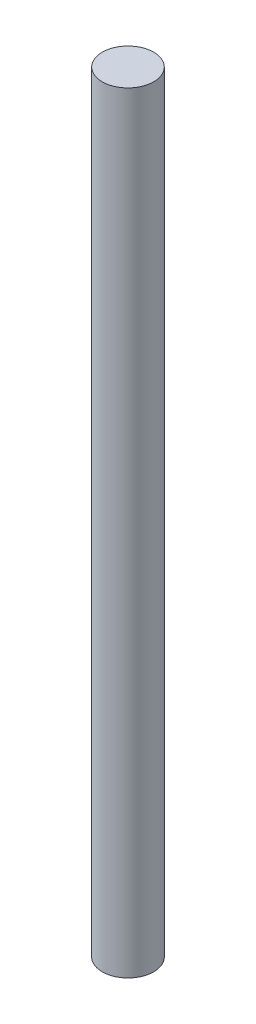
ISO-10303-21;
HEADER;
FILE_DESCRIPTION(('STEP AP214'),'2;1');
FILE_NAME('part.step','',(''),(''),'','','');
FILE_SCHEMA(('AUTOMOTIVE_DESIGN { 1 0 10303 214 1 1 1 1 }'));
ENDSEC;
DATA;
#1=APPLICATION_CONTEXT('core data for automotive mechanical design processes');
#2=APPLICATION_PROTOCOL_DEFINITION('international standard','automotive_design',2000,#1);
#3=PRODUCT_CONTEXT('',#1,'mechanical');
#4=PRODUCT('Part','Part','',(#3));
#5=PRODUCT_RELATED_PRODUCT_CATEGORY('part','',(#4));
#6=PRODUCT_DEFINITION_FORMATION('','',#4);
#7=PRODUCT_DEFINITION_CONTEXT('part definition',#1,'design');
#8=PRODUCT_DEFINITION('design','',#6,#7);
#9=PRODUCT_DEFINITION_SHAPE('','',#8);
#10=(LENGTH_UNIT() NAMED_UNIT(*) SI_UNIT(.MILLI.,.METRE.));
#11=(NAMED_UNIT(*) PLANE_ANGLE_UNIT() SI_UNIT($,.RADIAN.));
#12=(NAMED_UNIT(*) SI_UNIT($,.STERADIAN.) SOLID_ANGLE_UNIT());
#13=UNCERTAINTY_MEASURE_WITH_UNIT(LENGTH_MEASURE(1.E-05),#10,'distance_accuracy_value','');
#14=(GEOMETRIC_REPRESENTATION_CONTEXT(3) GLOBAL_UNCERTAINTY_ASSIGNED_CONTEXT((#13)) GLOBAL_UNIT_ASSIGNED_CONTEXT((#10,
#11,#12)) REPRESENTATION_CONTEXT('',''));
#15=CARTESIAN_POINT('',(0.,0.,0.));
#16=DIRECTION('',(0.,0.,1.));
#17=DIRECTION('',(1.,0.,0.));
#18=AXIS2_PLACEMENT_3D('',#15,#16,#17);
#19=CARTESIAN_POINT('',(0.,120.,0.));
#20=DIRECTION('',(0.,-1.,0.));
#21=DIRECTION('',(0.,0.,-1.));
#22=AXIS2_PLACEMENT_3D('',#19,#20,#21);
#23=CYLINDRICAL_SURFACE('',#22,4.);
#24=CARTESIAN_POINT('',(0.,120.,0.));
#25=DIRECTION('',(0.,1.,0.));
#26=DIRECTION('',(0.,0.,1.));
#27=AXIS2_PLACEMENT_3D('',#24,#25,#26);
#28=CIRCLE('',#27,4.);
#29=CARTESIAN_POINT('',(0.,120.,4.));
#30=VERTEX_POINT('',#29);
#31=EDGE_CURVE('E10',#30,#30,#28,.T.);
#32=ORIENTED_EDGE('',*,*,#31,.F.);
#33=EDGE_LOOP('',(#32));
#34=FACE_BOUND('',#33,.T.);
#35=CARTESIAN_POINT('',(0.,0.,0.));
#36=DIRECTION('',(0.,1.,0.));
#37=DIRECTION('',(0.,0.,1.));
#38=AXIS2_PLACEMENT_3D('',#35,#36,#37);
#39=CIRCLE('',#38,4.);
#40=CARTESIAN_POINT('',(0.,0.,4.));
#41=VERTEX_POINT('',#40);
#42=EDGE_CURVE('E37',#41,#41,#39,.T.);
#43=ORIENTED_EDGE('',*,*,#42,.T.);
#44=EDGE_LOOP('',(#43));
#45=FACE_BOUND('',#44,.T.);
#46=ADVANCED_FACE('F34',(#34,#45),#23,.T.);
#47=CARTESIAN_POINT('',(0.,120.,0.));
#48=DIRECTION('',(0.,1.,0.));
#49=DIRECTION('',(0.,0.,1.));
#50=AXIS2_PLACEMENT_3D('',#47,#48,#49);
#51=PLANE('',#50);
#52=ORIENTED_EDGE('',*,*,#31,.T.);
#53=EDGE_LOOP('',(#52));
#54=FACE_BOUND('',#53,.T.);
#55=ADVANCED_FACE('F49',(#54),#51,.T.);
#56=CARTESIAN_POINT('',(0.,0.,0.));
#57=DIRECTION('',(0.,1.,0.));
#58=DIRECTION('',(0.,0.,1.));
#59=AXIS2_PLACEMENT_3D('',#56,#57,#58);
#60=PLANE('',#59);
#61=ORIENTED_EDGE('',*,*,#42,.F.);
#62=EDGE_LOOP('',(#61));
#63=FACE_BOUND('',#62,.T.);
#64=ADVANCED_FACE('F47',(#63),#60,.F.);
#65=CLOSED_SHELL('',(#46,#55,#64));
#66=MANIFOLD_SOLID_BREP('B2',#65);
#67=ADVANCED_BREP_SHAPE_REPRESENTATION('',(#18,#66),#14);
#68=SHAPE_DEFINITION_REPRESENTATION(#9,#67);
ENDSEC;
END-ISO-10303-21;
